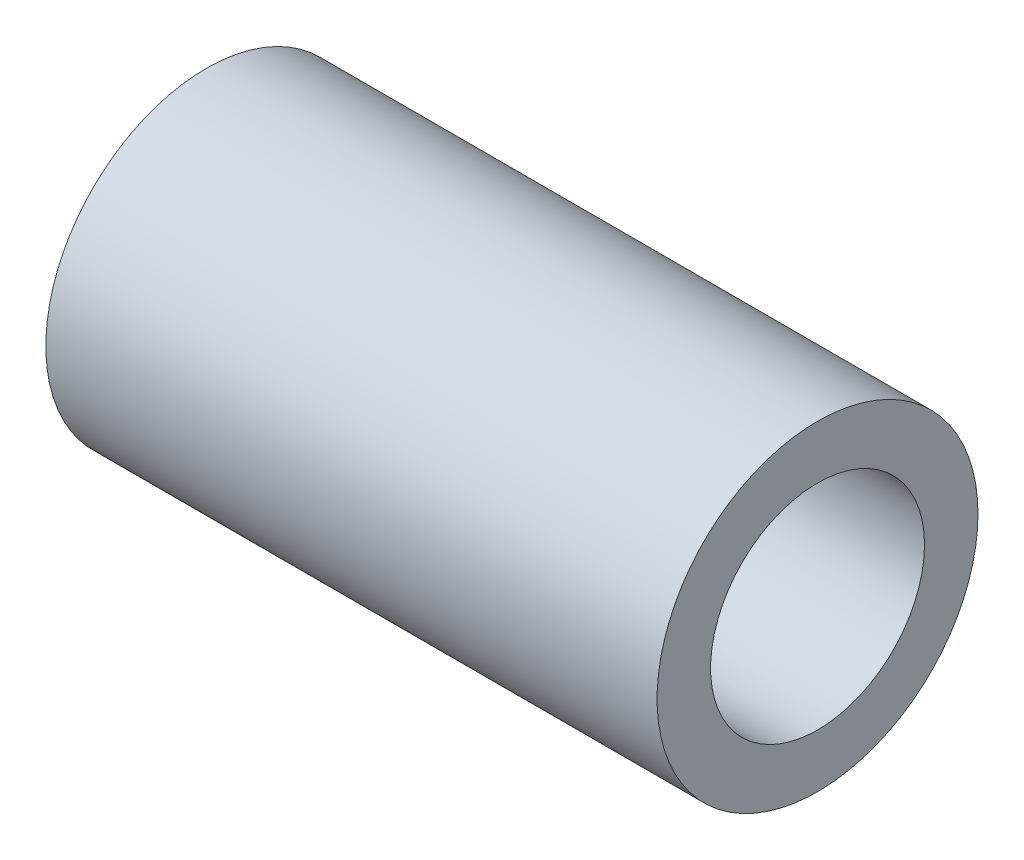
ISO-10303-21;
HEADER;
FILE_DESCRIPTION(('STEP AP214'),'2;1');
FILE_NAME('part.step','',(''),(''),'','','');
FILE_SCHEMA(('AUTOMOTIVE_DESIGN { 1 0 10303 214 1 1 1 1 }'));
ENDSEC;
DATA;
#1=APPLICATION_CONTEXT('core data for automotive mechanical design processes');
#2=APPLICATION_PROTOCOL_DEFINITION('international standard','automotive_design',2000,#1);
#3=PRODUCT_CONTEXT('',#1,'mechanical');
#4=PRODUCT('Part','Part','',(#3));
#5=PRODUCT_RELATED_PRODUCT_CATEGORY('part','',(#4));
#6=PRODUCT_DEFINITION_FORMATION('','',#4);
#7=PRODUCT_DEFINITION_CONTEXT('part definition',#1,'design');
#8=PRODUCT_DEFINITION('design','',#6,#7);
#9=PRODUCT_DEFINITION_SHAPE('','',#8);
#10=(LENGTH_UNIT() NAMED_UNIT(*) SI_UNIT(.MILLI.,.METRE.));
#11=(NAMED_UNIT(*) PLANE_ANGLE_UNIT() SI_UNIT($,.RADIAN.));
#12=(NAMED_UNIT(*) SI_UNIT($,.STERADIAN.) SOLID_ANGLE_UNIT());
#13=UNCERTAINTY_MEASURE_WITH_UNIT(LENGTH_MEASURE(1.E-05),#10,'distance_accuracy_value','');
#14=(GEOMETRIC_REPRESENTATION_CONTEXT(3) GLOBAL_UNCERTAINTY_ASSIGNED_CONTEXT((#13)) GLOBAL_UNIT_ASSIGNED_CONTEXT((#10,
#11,#12)) REPRESENTATION_CONTEXT('',''));
#15=CARTESIAN_POINT('',(0.,0.,0.));
#16=DIRECTION('',(0.,0.,1.));
#17=DIRECTION('',(1.,0.,0.));
#18=AXIS2_PLACEMENT_3D('',#15,#16,#17);
#19=CARTESIAN_POINT('',(6.,0.,0.));
#20=DIRECTION('',(1.,0.,0.));
#21=DIRECTION('',(0.,0.,-1.));
#22=AXIS2_PLACEMENT_3D('',#19,#20,#21);
#23=PLANE('',#22);
#24=CARTESIAN_POINT('',(6.,0.,0.));
#25=DIRECTION('',(1.,0.,0.));
#26=DIRECTION('',(0.,0.,-1.));
#27=AXIS2_PLACEMENT_3D('',#24,#25,#26);
#28=CIRCLE('',#27,1.575);
#29=CARTESIAN_POINT('',(6.,0.,-1.575));
#30=VERTEX_POINT('',#29);
#31=EDGE_CURVE('E10',#30,#30,#28,.T.);
#32=ORIENTED_EDGE('',*,*,#31,.T.);
#33=EDGE_LOOP('',(#32));
#34=FACE_BOUND('',#33,.T.);
#35=CARTESIAN_POINT('',(6.,0.,0.));
#36=DIRECTION('',(1.,0.,0.));
#37=DIRECTION('',(0.,0.,-1.));
#38=AXIS2_PLACEMENT_3D('',#35,#36,#37);
#39=CIRCLE('',#38,1.05);
#40=CARTESIAN_POINT('',(6.,0.,-1.05));
#41=VERTEX_POINT('',#40);
#42=EDGE_CURVE('E56',#41,#41,#39,.T.);
#43=ORIENTED_EDGE('',*,*,#42,.F.);
#44=EDGE_LOOP('',(#43));
#45=FACE_BOUND('',#44,.T.);
#46=ADVANCED_FACE('F43',(#34,#45),#23,.T.);
#47=CARTESIAN_POINT('',(0.,0.,0.));
#48=DIRECTION('',(1.,0.,0.));
#49=DIRECTION('',(0.,0.,-1.));
#50=AXIS2_PLACEMENT_3D('',#47,#48,#49);
#51=PLANE('',#50);
#52=CARTESIAN_POINT('',(0.,0.,0.));
#53=DIRECTION('',(1.,0.,0.));
#54=DIRECTION('',(0.,0.,-1.));
#55=AXIS2_PLACEMENT_3D('',#52,#53,#54);
#56=CIRCLE('',#55,1.575);
#57=CARTESIAN_POINT('',(0.,0.,-1.575));
#58=VERTEX_POINT('',#57);
#59=EDGE_CURVE('E47',#58,#58,#56,.T.);
#60=ORIENTED_EDGE('',*,*,#59,.F.);
#61=EDGE_LOOP('',(#60));
#62=FACE_BOUND('',#61,.T.);
#63=CARTESIAN_POINT('',(0.,0.,0.));
#64=DIRECTION('',(1.,0.,0.));
#65=DIRECTION('',(0.,0.,-1.));
#66=AXIS2_PLACEMENT_3D('',#63,#64,#65);
#67=CIRCLE('',#66,1.05);
#68=CARTESIAN_POINT('',(0.,0.,-1.05));
#69=VERTEX_POINT('',#68);
#70=EDGE_CURVE('E58',#69,#69,#67,.T.);
#71=ORIENTED_EDGE('',*,*,#70,.T.);
#72=EDGE_LOOP('',(#71));
#73=FACE_BOUND('',#72,.T.);
#74=ADVANCED_FACE('F70',(#62,#73),#51,.F.);
#75=CARTESIAN_POINT('',(6.,0.,0.));
#76=DIRECTION('',(-1.,0.,0.));
#77=DIRECTION('',(0.,0.,1.));
#78=AXIS2_PLACEMENT_3D('',#75,#76,#77);
#79=CYLINDRICAL_SURFACE('',#78,1.575);
#80=ORIENTED_EDGE('',*,*,#31,.F.);
#81=EDGE_LOOP('',(#80));
#82=FACE_BOUND('',#81,.T.);
#83=ORIENTED_EDGE('',*,*,#59,.T.);
#84=EDGE_LOOP('',(#83));
#85=FACE_BOUND('',#84,.T.);
#86=ADVANCED_FACE('F45',(#82,#85),#79,.T.);
#87=CARTESIAN_POINT('',(6.,0.,0.));
#88=DIRECTION('',(-1.,0.,0.));
#89=DIRECTION('',(0.,0.,1.));
#90=AXIS2_PLACEMENT_3D('',#87,#88,#89);
#91=CYLINDRICAL_SURFACE('',#90,1.05);
#92=ORIENTED_EDGE('',*,*,#42,.T.);
#93=EDGE_LOOP('',(#92));
#94=FACE_BOUND('',#93,.T.);
#95=ORIENTED_EDGE('',*,*,#70,.F.);
#96=EDGE_LOOP('',(#95));
#97=FACE_BOUND('',#96,.T.);
#98=ADVANCED_FACE('F66',(#94,#97),#91,.F.);
#99=CLOSED_SHELL('',(#46,#74,#86,#98));
#100=MANIFOLD_SOLID_BREP('B2',#99);
#101=ADVANCED_BREP_SHAPE_REPRESENTATION('',(#18,#100),#14);
#102=SHAPE_DEFINITION_REPRESENTATION(#9,#101);
ENDSEC;
END-ISO-10303-21;
